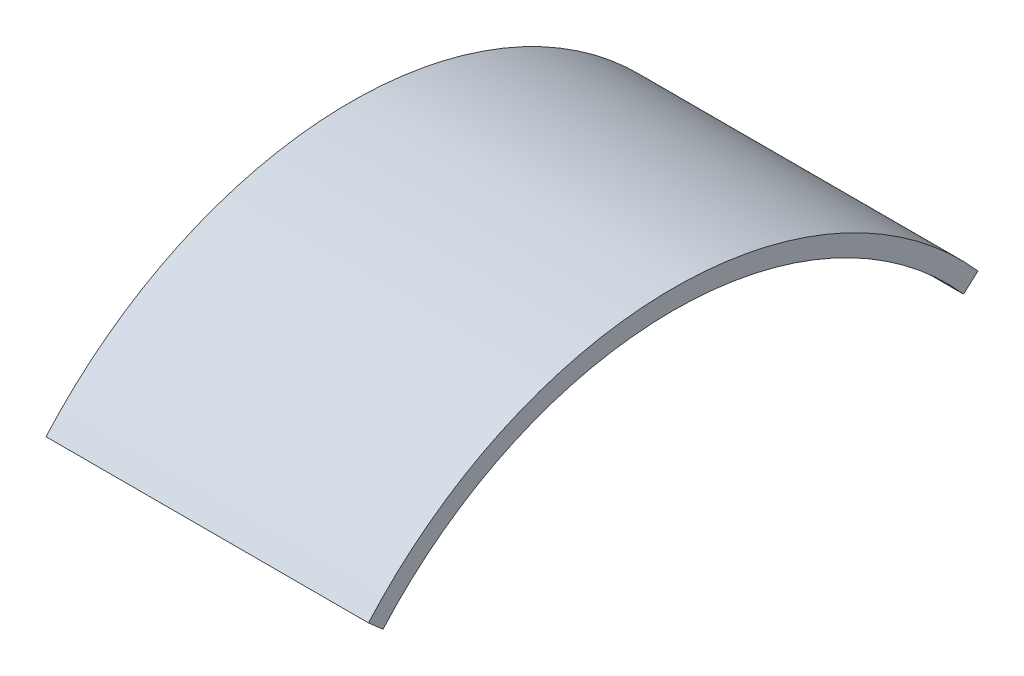
ISO-10303-21;
HEADER;
FILE_DESCRIPTION(('STEP AP214'),'2;1');
FILE_NAME('part.step','',(''),(''),'','','');
FILE_SCHEMA(('AUTOMOTIVE_DESIGN { 1 0 10303 214 1 1 1 1 }'));
ENDSEC;
DATA;
#1=APPLICATION_CONTEXT('core data for automotive mechanical design processes');
#2=APPLICATION_PROTOCOL_DEFINITION('international standard','automotive_design',2000,#1);
#3=PRODUCT_CONTEXT('',#1,'mechanical');
#4=PRODUCT('Part','Part','',(#3));
#5=PRODUCT_RELATED_PRODUCT_CATEGORY('part','',(#4));
#6=PRODUCT_DEFINITION_FORMATION('','',#4);
#7=PRODUCT_DEFINITION_CONTEXT('part definition',#1,'design');
#8=PRODUCT_DEFINITION('design','',#6,#7);
#9=PRODUCT_DEFINITION_SHAPE('','',#8);
#10=(LENGTH_UNIT() NAMED_UNIT(*) SI_UNIT(.MILLI.,.METRE.));
#11=(NAMED_UNIT(*) PLANE_ANGLE_UNIT() SI_UNIT($,.RADIAN.));
#12=(NAMED_UNIT(*) SI_UNIT($,.STERADIAN.) SOLID_ANGLE_UNIT());
#13=UNCERTAINTY_MEASURE_WITH_UNIT(LENGTH_MEASURE(1.E-05),#10,'distance_accuracy_value','');
#14=(GEOMETRIC_REPRESENTATION_CONTEXT(3) GLOBAL_UNCERTAINTY_ASSIGNED_CONTEXT((#13)) GLOBAL_UNIT_ASSIGNED_CONTEXT((#10,
#11,#12)) REPRESENTATION_CONTEXT('',''));
#15=CARTESIAN_POINT('',(0.,0.,0.));
#16=DIRECTION('',(0.,0.,1.));
#17=DIRECTION('',(1.,0.,0.));
#18=AXIS2_PLACEMENT_3D('',#15,#16,#17);
#19=CARTESIAN_POINT('',(50.,0.,0.));
#20=DIRECTION('',(-1.,0.,0.));
#21=DIRECTION('',(0.,0.,1.));
#22=AXIS2_PLACEMENT_3D('',#19,#20,#21);
#23=CYLINDRICAL_SURFACE('',#22,60.);
#24=CARTESIAN_POINT('',(0.,0.,0.));
#25=DIRECTION('',(-1.,0.,0.));
#26=DIRECTION('',(0.,0.,1.));
#27=AXIS2_PLACEMENT_3D('',#24,#25,#26);
#28=CIRCLE('',#27,60.);
#29=CARTESIAN_POINT('',(0.,39.6862696659689,45.));
#30=VERTEX_POINT('',#29);
#31=CARTESIAN_POINT('',(0.,39.6862696659689,-45.));
#32=VERTEX_POINT('',#31);
#33=EDGE_CURVE('E96',#30,#32,#28,.T.);
#34=ORIENTED_EDGE('',*,*,#33,.T.);
#35=DIRECTION('',(-1.,0.,0.));
#36=VECTOR('',#35,1.);
#37=CARTESIAN_POINT('',(50.,39.6862696659689,-45.));
#38=LINE('',#37,#36);
#39=CARTESIAN_POINT('',(50.,39.6862696659689,-45.));
#40=VERTEX_POINT('',#39);
#41=EDGE_CURVE('E11',#40,#32,#38,.T.);
#42=ORIENTED_EDGE('',*,*,#41,.F.);
#43=CARTESIAN_POINT('',(50.,0.,0.));
#44=DIRECTION('',(-1.,0.,0.));
#45=DIRECTION('',(0.,0.,1.));
#46=AXIS2_PLACEMENT_3D('',#43,#44,#45);
#47=CIRCLE('',#46,60.);
#48=CARTESIAN_POINT('',(50.,39.6862696659689,45.));
#49=VERTEX_POINT('',#48);
#50=EDGE_CURVE('E84',#49,#40,#47,.T.);
#51=ORIENTED_EDGE('',*,*,#50,.F.);
#52=DIRECTION('',(-1.,0.,0.));
#53=VECTOR('',#52,1.);
#54=CARTESIAN_POINT('',(50.,39.6862696659689,45.));
#55=LINE('',#54,#53);
#56=EDGE_CURVE('E92',#49,#30,#55,.T.);
#57=ORIENTED_EDGE('',*,*,#56,.T.);
#58=EDGE_LOOP('',(#34,#42,#51,#57));
#59=FACE_BOUND('',#58,.T.);
#60=ADVANCED_FACE('F33',(#59),#23,.F.);
#61=CARTESIAN_POINT('',(50.,39.6862696659689,-45.));
#62=DIRECTION('',(0.,0.75,0.661437827766148));
#63=DIRECTION('',(0.,-0.661437827766148,0.75));
#64=AXIS2_PLACEMENT_3D('',#61,#62,#63);
#65=PLANE('',#64);
#66=DIRECTION('',(0.,0.661437827766148,-0.75));
#67=VECTOR('',#66,1.);
#68=CARTESIAN_POINT('',(0.,39.6862696659689,-45.));
#69=LINE('',#68,#67);
#70=CARTESIAN_POINT('',(0.,41.6705831492673,-47.25));
#71=VERTEX_POINT('',#70);
#72=EDGE_CURVE('E88',#32,#71,#69,.T.);
#73=ORIENTED_EDGE('',*,*,#72,.T.);
#74=DIRECTION('',(-1.,0.,0.));
#75=VECTOR('',#74,1.);
#76=CARTESIAN_POINT('',(50.,41.6705831492673,-47.25));
#77=LINE('',#76,#75);
#78=CARTESIAN_POINT('',(50.,41.6705831492673,-47.25));
#79=VERTEX_POINT('',#78);
#80=EDGE_CURVE('E41',#79,#71,#77,.T.);
#81=ORIENTED_EDGE('',*,*,#80,.F.);
#82=DIRECTION('',(0.,0.661437827766148,-0.75));
#83=VECTOR('',#82,1.);
#84=CARTESIAN_POINT('',(50.,39.6862696659689,-45.));
#85=LINE('',#84,#83);
#86=EDGE_CURVE('E79',#40,#79,#85,.T.);
#87=ORIENTED_EDGE('',*,*,#86,.F.);
#88=ORIENTED_EDGE('',*,*,#41,.T.);
#89=EDGE_LOOP('',(#73,#81,#87,#88));
#90=FACE_BOUND('',#89,.T.);
#91=ADVANCED_FACE('F87',(#90),#65,.F.);
#92=CARTESIAN_POINT('',(50.,0.,0.));
#93=DIRECTION('',(-1.,0.,0.));
#94=DIRECTION('',(0.,0.,1.));
#95=AXIS2_PLACEMENT_3D('',#92,#93,#94);
#96=CYLINDRICAL_SURFACE('',#95,63.);
#97=CARTESIAN_POINT('',(0.,0.,0.));
#98=DIRECTION('',(1.,0.,0.));
#99=DIRECTION('',(0.,0.,1.));
#100=AXIS2_PLACEMENT_3D('',#97,#98,#99);
#101=CIRCLE('',#100,63.);
#102=CARTESIAN_POINT('',(0.,41.6705831492673,47.25));
#103=VERTEX_POINT('',#102);
#104=EDGE_CURVE('E66',#71,#103,#101,.T.);
#105=ORIENTED_EDGE('',*,*,#104,.T.);
#106=DIRECTION('',(-1.,0.,0.));
#107=VECTOR('',#106,1.);
#108=CARTESIAN_POINT('',(50.,41.6705831492673,47.25));
#109=LINE('',#108,#107);
#110=CARTESIAN_POINT('',(50.,41.6705831492673,47.25));
#111=VERTEX_POINT('',#110);
#112=EDGE_CURVE('E89',#111,#103,#109,.T.);
#113=ORIENTED_EDGE('',*,*,#112,.F.);
#114=CARTESIAN_POINT('',(50.,0.,0.));
#115=DIRECTION('',(1.,0.,0.));
#116=DIRECTION('',(0.,0.,1.));
#117=AXIS2_PLACEMENT_3D('',#114,#115,#116);
#118=CIRCLE('',#117,63.);
#119=EDGE_CURVE('E82',#79,#111,#118,.T.);
#120=ORIENTED_EDGE('',*,*,#119,.F.);
#121=ORIENTED_EDGE('',*,*,#80,.T.);
#122=EDGE_LOOP('',(#105,#113,#120,#121));
#123=FACE_BOUND('',#122,.T.);
#124=ADVANCED_FACE('F90',(#123),#96,.T.);
#125=CARTESIAN_POINT('',(50.,39.6862696659689,45.));
#126=DIRECTION('',(0.,0.75,-0.661437827766148));
#127=DIRECTION('',(0.,0.661437827766148,0.75));
#128=AXIS2_PLACEMENT_3D('',#125,#126,#127);
#129=PLANE('',#128);
#130=DIRECTION('',(0.,-0.661437827766148,-0.75));
#131=VECTOR('',#130,1.);
#132=CARTESIAN_POINT('',(0.,39.6862696659689,45.));
#133=LINE('',#132,#131);
#134=EDGE_CURVE('E72',#103,#30,#133,.T.);
#135=ORIENTED_EDGE('',*,*,#134,.T.);
#136=ORIENTED_EDGE('',*,*,#56,.F.);
#137=DIRECTION('',(0.,-0.661437827766148,-0.75));
#138=VECTOR('',#137,1.);
#139=CARTESIAN_POINT('',(50.,39.6862696659689,45.));
#140=LINE('',#139,#138);
#141=EDGE_CURVE('E49',#111,#49,#140,.T.);
#142=ORIENTED_EDGE('',*,*,#141,.F.);
#143=ORIENTED_EDGE('',*,*,#112,.T.);
#144=EDGE_LOOP('',(#135,#136,#142,#143));
#145=FACE_BOUND('',#144,.T.);
#146=ADVANCED_FACE('F103',(#145),#129,.F.);
#147=CARTESIAN_POINT('',(50.,0.,0.));
#148=DIRECTION('',(-1.,0.,0.));
#149=DIRECTION('',(0.,0.,1.));
#150=AXIS2_PLACEMENT_3D('',#147,#148,#149);
#151=PLANE('',#150);
#152=ORIENTED_EDGE('',*,*,#50,.T.);
#153=ORIENTED_EDGE('',*,*,#86,.T.);
#154=ORIENTED_EDGE('',*,*,#119,.T.);
#155=ORIENTED_EDGE('',*,*,#141,.T.);
#156=EDGE_LOOP('',(#152,#153,#154,#155));
#157=FACE_BOUND('',#156,.T.);
#158=ADVANCED_FACE('F80',(#157),#151,.F.);
#159=CARTESIAN_POINT('',(0.,0.,0.));
#160=DIRECTION('',(-1.,0.,0.));
#161=DIRECTION('',(0.,0.,1.));
#162=AXIS2_PLACEMENT_3D('',#159,#160,#161);
#163=PLANE('',#162);
#164=ORIENTED_EDGE('',*,*,#33,.F.);
#165=ORIENTED_EDGE('',*,*,#134,.F.);
#166=ORIENTED_EDGE('',*,*,#104,.F.);
#167=ORIENTED_EDGE('',*,*,#72,.F.);
#168=EDGE_LOOP('',(#164,#165,#166,#167));
#169=FACE_BOUND('',#168,.T.);
#170=ADVANCED_FACE('F106',(#169),#163,.T.);
#171=CLOSED_SHELL('',(#60,#91,#124,#146,#158,#170));
#172=MANIFOLD_SOLID_BREP('B2',#171);
#173=ADVANCED_BREP_SHAPE_REPRESENTATION('',(#18,#172),#14);
#174=SHAPE_DEFINITION_REPRESENTATION(#9,#173);
ENDSEC;
END-ISO-10303-21;
